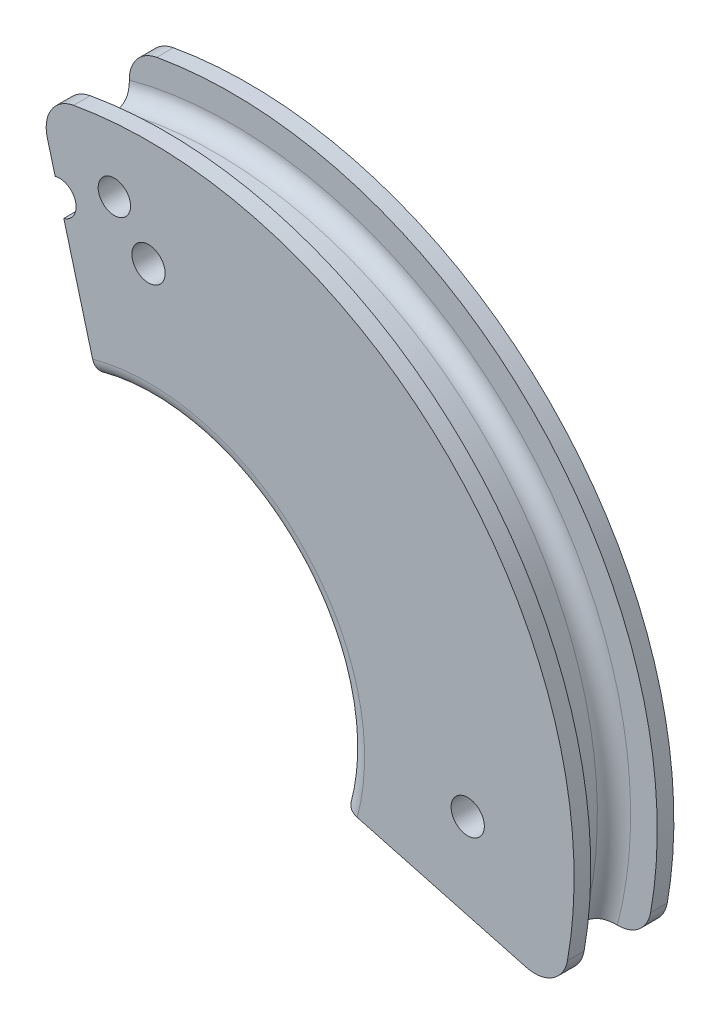
ISO-10303-21;
HEADER;
FILE_DESCRIPTION(('STEP AP214'),'2;1');
FILE_NAME('part.step','',(''),(''),'','','');
FILE_SCHEMA(('AUTOMOTIVE_DESIGN { 1 0 10303 214 1 1 1 1 }'));
ENDSEC;
DATA;
#1=APPLICATION_CONTEXT('core data for automotive mechanical design processes');
#2=APPLICATION_PROTOCOL_DEFINITION('international standard','automotive_design',2000,#1);
#3=PRODUCT_CONTEXT('',#1,'mechanical');
#4=PRODUCT('Part','Part','',(#3));
#5=PRODUCT_RELATED_PRODUCT_CATEGORY('part','',(#4));
#6=PRODUCT_DEFINITION_FORMATION('','',#4);
#7=PRODUCT_DEFINITION_CONTEXT('part definition',#1,'design');
#8=PRODUCT_DEFINITION('design','',#6,#7);
#9=PRODUCT_DEFINITION_SHAPE('','',#8);
#10=(LENGTH_UNIT() NAMED_UNIT(*) SI_UNIT(.MILLI.,.METRE.));
#11=(NAMED_UNIT(*) PLANE_ANGLE_UNIT() SI_UNIT($,.RADIAN.));
#12=(NAMED_UNIT(*) SI_UNIT($,.STERADIAN.) SOLID_ANGLE_UNIT());
#13=UNCERTAINTY_MEASURE_WITH_UNIT(LENGTH_MEASURE(1.E-05),#10,'distance_accuracy_value','');
#14=(GEOMETRIC_REPRESENTATION_CONTEXT(3) GLOBAL_UNCERTAINTY_ASSIGNED_CONTEXT((#13)) GLOBAL_UNIT_ASSIGNED_CONTEXT((#10,
#11,#12)) REPRESENTATION_CONTEXT('',''));
#15=CARTESIAN_POINT('',(0.,0.,0.));
#16=DIRECTION('',(0.,0.,1.));
#17=DIRECTION('',(1.,0.,0.));
#18=AXIS2_PLACEMENT_3D('',#15,#16,#17);
#19=CARTESIAN_POINT('',(-3.74363575167314,13.9714388302752,-1.5));
#20=DIRECTION('',(0.965925826289067,0.258819045102525,0.));
#21=DIRECTION('',(-0.258819045102525,0.965925826289067,0.));
#22=AXIS2_PLACEMENT_3D('',#19,#20,#21);
#23=PLANE('',#22);
#24=CARTESIAN_POINT('',(-3.1058285412303,11.5911099154688,-0.499999999999998));
#25=DIRECTION('',(0.965925826289067,0.258819045102525,0.));
#26=DIRECTION('',(-0.258819045102525,0.965925826289067,0.));
#27=AXIS2_PLACEMENT_3D('',#24,#25,#26);
#28=CIRCLE('',#27,0.500000000000002);
#29=CARTESIAN_POINT('',(-2.97641901867904,11.1081470023243,-0.499999999999998));
#30=VERTEX_POINT('',#29);
#31=CARTESIAN_POINT('',(-3.04307806183475,11.3569219381653,-0.937285225707565));
#32=VERTEX_POINT('',#31);
#33=EDGE_CURVE('E197',#30,#32,#28,.T.);
#34=ORIENTED_EDGE('',*,*,#33,.T.);
#35=DIRECTION('',(0.,0.,-1.));
#36=VECTOR('',#35,1.);
#37=CARTESIAN_POINT('',(-3.04307806183475,11.3569219381653,-1.5));
#38=LINE('',#37,#36);
#39=CARTESIAN_POINT('',(-3.04307806183475,11.3569219381653,-1.5));
#40=VERTEX_POINT('',#39);
#41=EDGE_CURVE('E11',#32,#40,#38,.T.);
#42=ORIENTED_EDGE('',*,*,#41,.T.);
#43=DIRECTION('',(-0.258819045102525,0.965925826289067,0.));
#44=VECTOR('',#43,1.);
#45=CARTESIAN_POINT('',(-3.74363575167314,13.9714388302752,-1.5));
#46=LINE('',#45,#44);
#47=CARTESIAN_POINT('',(-2.80628126212076,10.473184250563,-1.5));
#48=VERTEX_POINT('',#47);
#49=EDGE_CURVE('E179',#48,#40,#46,.T.);
#50=ORIENTED_EDGE('',*,*,#49,.F.);
#51=DIRECTION('',(0.,0.,1.));
#52=VECTOR('',#51,1.);
#53=CARTESIAN_POINT('',(-2.80628126212076,10.473184250563,-1.5));
#54=LINE('',#53,#52);
#55=CARTESIAN_POINT('',(-2.80628126212076,10.473184250563,1.5));
#56=VERTEX_POINT('',#55);
#57=EDGE_CURVE('E159',#48,#56,#54,.T.);
#58=ORIENTED_EDGE('',*,*,#57,.T.);
#59=DIRECTION('',(-0.258819045102525,0.965925826289067,0.));
#60=VECTOR('',#59,1.);
#61=CARTESIAN_POINT('',(-3.74363575167314,13.9714388302752,1.5));
#62=LINE('',#61,#60);
#63=CARTESIAN_POINT('',(-3.04307806183475,11.3569219381653,1.5));
#64=VERTEX_POINT('',#63);
#65=EDGE_CURVE('E370',#56,#64,#62,.T.);
#66=ORIENTED_EDGE('',*,*,#65,.T.);
#67=DIRECTION('',(0.,0.,-1.));
#68=VECTOR('',#67,1.);
#69=CARTESIAN_POINT('',(-3.04307806183475,11.3569219381653,1.));
#70=LINE('',#69,#68);
#71=CARTESIAN_POINT('',(-3.04307806183475,11.3569219381653,0.937285225707565));
#72=VERTEX_POINT('',#71);
#73=EDGE_CURVE('E41',#64,#72,#70,.T.);
#74=ORIENTED_EDGE('',*,*,#73,.T.);
#75=CARTESIAN_POINT('',(-3.1058285412303,11.5911099154688,0.499999999999998));
#76=DIRECTION('',(0.965925826289067,0.258819045102525,0.));
#77=DIRECTION('',(-0.258819045102525,0.965925826289067,0.));
#78=AXIS2_PLACEMENT_3D('',#75,#76,#77);
#79=CIRCLE('',#78,0.500000000000002);
#80=CARTESIAN_POINT('',(-2.97641901867904,11.1081470023243,0.499999999999998));
#81=VERTEX_POINT('',#80);
#82=EDGE_CURVE('E189',#72,#81,#79,.T.);
#83=ORIENTED_EDGE('',*,*,#82,.T.);
#84=DIRECTION('',(0.,0.,1.));
#85=VECTOR('',#84,1.);
#86=CARTESIAN_POINT('',(-2.97641901867904,11.1081470023243,0.));
#87=LINE('',#86,#85);
#88=EDGE_CURVE('E195',#81,#30,#87,.F.);
#89=ORIENTED_EDGE('',*,*,#88,.T.);
#90=EDGE_LOOP('',(#34,#42,#50,#58,#66,#74,#83,#89));
#91=FACE_BOUND('',#90,.T.);
#92=ADVANCED_FACE('F32',(#91),#23,.F.);
#93=CARTESIAN_POINT('',(0.,0.,1.5));
#94=DIRECTION('',(0.,0.,1.));
#95=DIRECTION('',(1.,0.,0.));
#96=AXIS2_PLACEMENT_3D('',#93,#94,#95);
#97=PLANE('',#96);
#98=DIRECTION('',(-0.965925826289068,0.258819045102521,0.));
#99=VECTOR('',#98,1.);
#100=CARTESIAN_POINT('',(14.9002332262777,-3.9925054600165,1.5));
#101=LINE('',#100,#99);
#102=CARTESIAN_POINT('',(11.3569219381653,-3.0430780618347,1.5));
#103=VERTEX_POINT('',#102);
#104=CARTESIAN_POINT('',(6.27851787087894,-1.68232379316639,1.5));
#105=VERTEX_POINT('',#104);
#106=EDGE_CURVE('E369',#103,#105,#101,.T.);
#107=ORIENTED_EDGE('',*,*,#106,.F.);
#108=CARTESIAN_POINT('',(11.6157409832678,-2.07715223554563,1.5));
#109=DIRECTION('',(0.,0.,1.));
#110=DIRECTION('',(1.,0.,0.));
#111=AXIS2_PLACEMENT_3D('',#108,#109,#110);
#112=CIRCLE('',#111,1.);
#113=CARTESIAN_POINT('',(12.6001258123583,-2.2531820860156,1.5));
#114=VERTEX_POINT('',#113);
#115=EDGE_CURVE('E422',#103,#114,#112,.T.);
#116=ORIENTED_EDGE('',*,*,#115,.T.);
#117=CARTESIAN_POINT('',(0.,0.,1.5));
#118=DIRECTION('',(0.,0.,1.));
#119=DIRECTION('',(1.,0.,0.));
#120=AXIS2_PLACEMENT_3D('',#117,#118,#119);
#121=CIRCLE('',#120,12.8);
#122=CARTESIAN_POINT('',(-2.25318208601565,12.6001258123583,1.5));
#123=VERTEX_POINT('',#122);
#124=EDGE_CURVE('E215',#114,#123,#121,.T.);
#125=ORIENTED_EDGE('',*,*,#124,.T.);
#126=CARTESIAN_POINT('',(-2.07715223554568,11.6157409832678,1.5));
#127=DIRECTION('',(0.,0.,1.));
#128=DIRECTION('',(1.,0.,0.));
#129=AXIS2_PLACEMENT_3D('',#126,#127,#128);
#130=CIRCLE('',#129,1.);
#131=EDGE_CURVE('E419',#123,#64,#130,.T.);
#132=ORIENTED_EDGE('',*,*,#131,.T.);
#133=ORIENTED_EDGE('',*,*,#65,.F.);
#134=CARTESIAN_POINT('',(-2.67687173956942,9.99022133741847,1.5));
#135=DIRECTION('',(0.,0.,1.));
#136=DIRECTION('',(1.,0.,0.));
#137=AXIS2_PLACEMENT_3D('',#134,#135,#136);
#138=CIRCLE('',#137,0.500000000000001);
#139=CARTESIAN_POINT('',(-2.54746221701823,9.50725842427392,1.5));
#140=VERTEX_POINT('',#139);
#141=EDGE_CURVE('E166',#140,#56,#138,.T.);
#142=ORIENTED_EDGE('',*,*,#141,.F.);
#143=CARTESIAN_POINT('',(-1.68232379316641,6.27851787087894,1.5));
#144=VERTEX_POINT('',#143);
#145=EDGE_CURVE('E190',#144,#140,#62,.T.);
#146=ORIENTED_EDGE('',*,*,#145,.F.);
#147=CARTESIAN_POINT('',(0.,0.,1.5));
#148=DIRECTION('',(0.,0.,1.));
#149=DIRECTION('',(1.,0.,0.));
#150=AXIS2_PLACEMENT_3D('',#147,#148,#149);
#151=CIRCLE('',#150,6.5);
#152=EDGE_CURVE('E256',#144,#105,#151,.F.);
#153=ORIENTED_EDGE('',*,*,#152,.T.);
#154=EDGE_LOOP('',(#107,#116,#125,#132,#133,#142,#146,#153));
#155=FACE_BOUND('',#154,.T.);
#156=CARTESIAN_POINT('',(-1.02683456633448,10.8290574039485,1.5));
#157=DIRECTION('',(0.,0.,1.));
#158=DIRECTION('',(1.,0.,0.));
#159=AXIS2_PLACEMENT_3D('',#156,#157,#158);
#160=CIRCLE('',#159,0.487297939704498);
#161=CARTESIAN_POINT('',(-0.539536626629982,10.8290574039485,1.5));
#162=VERTEX_POINT('',#161);
#163=EDGE_CURVE('E373',#162,#162,#160,.T.);
#164=ORIENTED_EDGE('',*,*,#163,.F.);
#165=EDGE_LOOP('',(#164));
#166=FACE_BOUND('',#165,.T.);
#167=CARTESIAN_POINT('',(9.6,0.,1.5));
#168=DIRECTION('',(0.,0.,1.));
#169=DIRECTION('',(1.,0.,0.));
#170=AXIS2_PLACEMENT_3D('',#167,#168,#169);
#171=CIRCLE('',#170,0.499999999999999);
#172=CARTESIAN_POINT('',(10.1,0.,1.5));
#173=VERTEX_POINT('',#172);
#174=EDGE_CURVE('E242',#173,#173,#171,.T.);
#175=ORIENTED_EDGE('',*,*,#174,.F.);
#176=EDGE_LOOP('',(#175));
#177=FACE_BOUND('',#176,.T.);
#178=CARTESIAN_POINT('',(1.00554662558682E-13,9.6,1.5));
#179=DIRECTION('',(0.,0.,1.));
#180=DIRECTION('',(1.,0.,0.));
#181=AXIS2_PLACEMENT_3D('',#178,#179,#180);
#182=CIRCLE('',#181,0.500000000000001);
#183=CARTESIAN_POINT('',(0.500000000000101,9.6,1.5));
#184=VERTEX_POINT('',#183);
#185=EDGE_CURVE('E236',#184,#184,#182,.T.);
#186=ORIENTED_EDGE('',*,*,#185,.F.);
#187=EDGE_LOOP('',(#186));
#188=FACE_BOUND('',#187,.T.);
#189=ADVANCED_FACE('F328',(#155,#166,#177,#188),#97,.T.);
#190=CARTESIAN_POINT('',(0.,0.,-1.5));
#191=DIRECTION('',(0.,0.,1.));
#192=DIRECTION('',(1.,0.,0.));
#193=AXIS2_PLACEMENT_3D('',#190,#191,#192);
#194=PLANE('',#193);
#195=CARTESIAN_POINT('',(-1.02683456633448,10.8290574039485,-1.5));
#196=DIRECTION('',(0.,0.,1.));
#197=DIRECTION('',(1.,0.,0.));
#198=AXIS2_PLACEMENT_3D('',#195,#196,#197);
#199=CIRCLE('',#198,0.487297939704498);
#200=CARTESIAN_POINT('',(-0.539536626629982,10.8290574039485,-1.5));
#201=VERTEX_POINT('',#200);
#202=EDGE_CURVE('E183',#201,#201,#199,.T.);
#203=ORIENTED_EDGE('',*,*,#202,.T.);
#204=EDGE_LOOP('',(#203));
#205=FACE_BOUND('',#204,.T.);
#206=CARTESIAN_POINT('',(0.,0.,-1.5));
#207=DIRECTION('',(0.,0.,1.));
#208=DIRECTION('',(1.,0.,0.));
#209=AXIS2_PLACEMENT_3D('',#206,#207,#208);
#210=CIRCLE('',#209,12.8);
#211=CARTESIAN_POINT('',(12.6001258123583,-2.2531820860156,-1.5));
#212=VERTEX_POINT('',#211);
#213=CARTESIAN_POINT('',(-2.25318208601565,12.6001258123583,-1.5));
#214=VERTEX_POINT('',#213);
#215=EDGE_CURVE('E218',#212,#214,#210,.T.);
#216=ORIENTED_EDGE('',*,*,#215,.F.);
#217=CARTESIAN_POINT('',(11.6157409832678,-2.07715223554563,-1.5));
#218=DIRECTION('',(0.,0.,1.));
#219=DIRECTION('',(1.,0.,0.));
#220=AXIS2_PLACEMENT_3D('',#217,#218,#219);
#221=CIRCLE('',#220,1.);
#222=CARTESIAN_POINT('',(11.3569219381653,-3.0430780618347,-1.5));
#223=VERTEX_POINT('',#222);
#224=EDGE_CURVE('E416',#212,#223,#221,.F.);
#225=ORIENTED_EDGE('',*,*,#224,.T.);
#226=DIRECTION('',(-0.965925826289068,0.258819045102521,0.));
#227=VECTOR('',#226,1.);
#228=CARTESIAN_POINT('',(14.9002332262777,-3.9925054600165,-1.5));
#229=LINE('',#228,#227);
#230=CARTESIAN_POINT('',(6.27851787087894,-1.68232379316639,-1.5));
#231=VERTEX_POINT('',#230);
#232=EDGE_CURVE('E187',#223,#231,#229,.T.);
#233=ORIENTED_EDGE('',*,*,#232,.T.);
#234=CARTESIAN_POINT('',(0.,0.,-1.5));
#235=DIRECTION('',(0.,0.,1.));
#236=DIRECTION('',(1.,0.,0.));
#237=AXIS2_PLACEMENT_3D('',#234,#235,#236);
#238=CIRCLE('',#237,6.5);
#239=CARTESIAN_POINT('',(-1.68232379316641,6.27851787087894,-1.5));
#240=VERTEX_POINT('',#239);
#241=EDGE_CURVE('E264',#231,#240,#238,.T.);
#242=ORIENTED_EDGE('',*,*,#241,.T.);
#243=CARTESIAN_POINT('',(-2.54746221701823,9.50725842427392,-1.5));
#244=VERTEX_POINT('',#243);
#245=EDGE_CURVE('E182',#240,#244,#46,.T.);
#246=ORIENTED_EDGE('',*,*,#245,.T.);
#247=CARTESIAN_POINT('',(-2.67687173956942,9.99022133741847,-1.5));
#248=DIRECTION('',(0.,0.,1.));
#249=DIRECTION('',(1.,0.,0.));
#250=AXIS2_PLACEMENT_3D('',#247,#248,#249);
#251=CIRCLE('',#250,0.500000000000001);
#252=EDGE_CURVE('E163',#244,#48,#251,.T.);
#253=ORIENTED_EDGE('',*,*,#252,.T.);
#254=ORIENTED_EDGE('',*,*,#49,.T.);
#255=CARTESIAN_POINT('',(-2.07715223554568,11.6157409832678,-1.5));
#256=DIRECTION('',(0.,0.,1.));
#257=DIRECTION('',(1.,0.,0.));
#258=AXIS2_PLACEMENT_3D('',#255,#256,#257);
#259=CIRCLE('',#258,1.);
#260=EDGE_CURVE('E420',#40,#214,#259,.F.);
#261=ORIENTED_EDGE('',*,*,#260,.T.);
#262=EDGE_LOOP('',(#216,#225,#233,#242,#246,#253,#254,#261));
#263=FACE_BOUND('',#262,.T.);
#264=CARTESIAN_POINT('',(9.6,0.,-1.5));
#265=DIRECTION('',(0.,0.,1.));
#266=DIRECTION('',(1.,0.,0.));
#267=AXIS2_PLACEMENT_3D('',#264,#265,#266);
#268=CIRCLE('',#267,0.499999999999999);
#269=CARTESIAN_POINT('',(10.1,0.,-1.5));
#270=VERTEX_POINT('',#269);
#271=EDGE_CURVE('E239',#270,#270,#268,.T.);
#272=ORIENTED_EDGE('',*,*,#271,.T.);
#273=EDGE_LOOP('',(#272));
#274=FACE_BOUND('',#273,.T.);
#275=CARTESIAN_POINT('',(1.00554662558682E-13,9.6,-1.5));
#276=DIRECTION('',(0.,0.,1.));
#277=DIRECTION('',(1.,0.,0.));
#278=AXIS2_PLACEMENT_3D('',#275,#276,#277);
#279=CIRCLE('',#278,0.500000000000001);
#280=CARTESIAN_POINT('',(0.500000000000101,9.6,-1.5));
#281=VERTEX_POINT('',#280);
#282=EDGE_CURVE('E235',#281,#281,#279,.T.);
#283=ORIENTED_EDGE('',*,*,#282,.T.);
#284=EDGE_LOOP('',(#283));
#285=FACE_BOUND('',#284,.T.);
#286=ADVANCED_FACE('F177',(#205,#263,#274,#285),#194,.F.);
#287=CARTESIAN_POINT('',(0.,0.,1.5));
#288=DIRECTION('',(0.,0.,-1.));
#289=DIRECTION('',(-1.,0.,0.));
#290=AXIS2_PLACEMENT_3D('',#287,#288,#289);
#291=CYLINDRICAL_SURFACE('',#290,6.);
#292=DIRECTION('',(0.,0.,-1.));
#293=VECTOR('',#292,1.);
#294=CARTESIAN_POINT('',(5.79555495773441,-1.55291427061513,1.5));
#295=LINE('',#294,#293);
#296=CARTESIAN_POINT('',(5.79555495773441,-1.55291427061513,1.));
#297=VERTEX_POINT('',#296);
#298=CARTESIAN_POINT('',(5.79555495773441,-1.55291427061513,-1.));
#299=VERTEX_POINT('',#298);
#300=EDGE_CURVE('E209',#297,#299,#295,.T.);
#301=ORIENTED_EDGE('',*,*,#300,.F.);
#302=CARTESIAN_POINT('',(0.,0.,1.));
#303=DIRECTION('',(0.,0.,1.));
#304=DIRECTION('',(1.,0.,0.));
#305=AXIS2_PLACEMENT_3D('',#302,#303,#304);
#306=CIRCLE('',#305,6.);
#307=CARTESIAN_POINT('',(-1.55291427061515,5.7955549577344,1.));
#308=VERTEX_POINT('',#307);
#309=EDGE_CURVE('E249',#297,#308,#306,.T.);
#310=ORIENTED_EDGE('',*,*,#309,.T.);
#311=DIRECTION('',(0.,0.,-1.));
#312=VECTOR('',#311,1.);
#313=CARTESIAN_POINT('',(-1.55291427061515,5.7955549577344,1.5));
#314=LINE('',#313,#312);
#315=CARTESIAN_POINT('',(-1.55291427061515,5.7955549577344,-1.));
#316=VERTEX_POINT('',#315);
#317=EDGE_CURVE('E199',#316,#308,#314,.F.);
#318=ORIENTED_EDGE('',*,*,#317,.F.);
#319=CARTESIAN_POINT('',(0.,0.,-1.));
#320=DIRECTION('',(0.,0.,1.));
#321=DIRECTION('',(1.,0.,0.));
#322=AXIS2_PLACEMENT_3D('',#319,#320,#321);
#323=CIRCLE('',#322,6.);
#324=EDGE_CURVE('E171',#316,#299,#323,.F.);
#325=ORIENTED_EDGE('',*,*,#324,.T.);
#326=EDGE_LOOP('',(#301,#310,#318,#325));
#327=FACE_BOUND('',#326,.T.);
#328=ADVANCED_FACE('F355',(#327),#291,.F.);
#329=CARTESIAN_POINT('',(9.6,0.,1.5));
#330=DIRECTION('',(0.,0.,-1.));
#331=DIRECTION('',(-1.,0.,0.));
#332=AXIS2_PLACEMENT_3D('',#329,#330,#331);
#333=CYLINDRICAL_SURFACE('',#332,0.499999999999999);
#334=ORIENTED_EDGE('',*,*,#174,.T.);
#335=EDGE_LOOP('',(#334));
#336=FACE_BOUND('',#335,.T.);
#337=ORIENTED_EDGE('',*,*,#271,.F.);
#338=EDGE_LOOP('',(#337));
#339=FACE_BOUND('',#338,.T.);
#340=ADVANCED_FACE('F398',(#336,#339),#333,.F.);
#341=CARTESIAN_POINT('',(1.00554662558682E-13,9.6,1.5));
#342=DIRECTION('',(0.,0.,-1.));
#343=DIRECTION('',(-1.,0.,0.));
#344=AXIS2_PLACEMENT_3D('',#341,#342,#343);
#345=CYLINDRICAL_SURFACE('',#344,0.500000000000001);
#346=ORIENTED_EDGE('',*,*,#185,.T.);
#347=EDGE_LOOP('',(#346));
#348=FACE_BOUND('',#347,.T.);
#349=ORIENTED_EDGE('',*,*,#282,.F.);
#350=EDGE_LOOP('',(#349));
#351=FACE_BOUND('',#350,.T.);
#352=ADVANCED_FACE('F324',(#348,#351),#345,.F.);
#353=CARTESIAN_POINT('',(0.,0.,-0.499999999999998));
#354=DIRECTION('',(0.,0.,1.));
#355=DIRECTION('',(1.,0.,0.));
#356=AXIS2_PLACEMENT_3D('',#353,#354,#355);
#357=TOROIDAL_SURFACE('',#356,12.,0.500000000000002);
#358=CARTESIAN_POINT('',(11.5911099154688,-3.10582854123025,-0.499999999999998));
#359=DIRECTION('',(0.258819045102521,0.965925826289068,0.));
#360=DIRECTION('',(-0.965925826289068,0.258819045102521,0.));
#361=AXIS2_PLACEMENT_3D('',#358,#359,#360);
#362=CIRCLE('',#361,0.500000000000002);
#363=CARTESIAN_POINT('',(11.3569219381653,-3.0430780618347,-0.937285225707565));
#364=VERTEX_POINT('',#363);
#365=CARTESIAN_POINT('',(11.1081470023243,-2.97641901867899,-0.499999999999998));
#366=VERTEX_POINT('',#365);
#367=EDGE_CURVE('E207',#364,#366,#362,.T.);
#368=ORIENTED_EDGE('',*,*,#367,.F.);
#369=CARTESIAN_POINT('',(11.3569219381653,-3.0430780618347,-0.937285225707565));
#370=CARTESIAN_POINT('',(11.3788907022271,-3.04899831611114,-0.949943539683777));
#371=CARTESIAN_POINT('',(11.4020780861868,-3.05437532809976,-0.960766771828405));
#372=CARTESIAN_POINT('',(11.4496007428172,-3.06353569894288,-0.978371417856458));
#373=CARTESIAN_POINT('',(11.4738969178736,-3.06735312809629,-0.985240754489292));
#374=CARTESIAN_POINT('',(11.5149442494263,-3.07219577508378,-0.993465018538642));
#375=CARTESIAN_POINT('',(11.531426924697,-3.07372956647898,-0.995903041619362));
#376=CARTESIAN_POINT('',(11.5648655383223,-3.07600064981872,-0.999184648848311));
#377=CARTESIAN_POINT('',(11.581824849703,-3.07672517119939,-1.00000282200904));
#378=CARTESIAN_POINT('',(11.59879381403,-3.07700862196078,-1.00000000000002));
#379=B_SPLINE_CURVE_WITH_KNOTS('',3,(#369,#370,#371,#372,#373,#374,#375,#376,#377,#378),
.UNSPECIFIED.,.F.,.F.,(4,2,2,2,4),(0.,0.0780439203151207,0.154277705368697,0.204380010066996,
0.25526224375088),.UNSPECIFIED.);
#380=CARTESIAN_POINT('',(11.59879381403,-3.0770086219606,-1.));
#381=VERTEX_POINT('',#380);
#382=EDGE_CURVE('E278',#364,#381,#379,.T.);
#383=ORIENTED_EDGE('',*,*,#382,.T.);
#384=CARTESIAN_POINT('',(0.,0.,-1.));
#385=DIRECTION('',(0.,0.,1.));
#386=DIRECTION('',(1.,0.,0.));
#387=AXIS2_PLACEMENT_3D('',#384,#385,#386);
#388=CIRCLE('',#387,12.);
#389=CARTESIAN_POINT('',(-3.07700862196066,11.59879381403,-1.));
#390=VERTEX_POINT('',#389);
#391=EDGE_CURVE('E224',#381,#390,#388,.T.);
#392=ORIENTED_EDGE('',*,*,#391,.T.);
#393=CARTESIAN_POINT('',(-3.07700862196066,11.59879381403,-1.));
#394=CARTESIAN_POINT('',(-3.07660458449419,11.5727601819554,-1.00003894836341));
#395=CARTESIAN_POINT('',(-3.07511026037198,11.5467286746794,-0.998086003587239));
#396=CARTESIAN_POINT('',(-3.07027226218953,11.4960485993055,-0.990321356288697));
#397=CARTESIAN_POINT('',(-3.06697226123266,11.4713819615224,-0.984600153749769));
#398=CARTESIAN_POINT('',(-3.06020836080265,11.4317329932909,-0.972022151730217));
#399=CARTESIAN_POINT('',(-3.05718836163848,11.4163292860042,-0.966226791143053));
#400=CARTESIAN_POINT('',(-3.05054927334866,11.386085156282,-0.952986500989708));
#401=CARTESIAN_POINT('',(-3.0469215908292,11.3712572336561,-0.945517299304913));
#402=CARTESIAN_POINT('',(-3.04307806183475,11.3569219381653,-0.937285225707566));
#403=B_SPLINE_CURVE_WITH_KNOTS('',3,(#393,#394,#395,#396,#397,#398,#399,#400,#401,#402),
.UNSPECIFIED.,.F.,.F.,(4,2,2,2,4),(0.,0.0780427071951764,0.154276292796439,0.204379307922696,
0.255262197451977),.UNSPECIFIED.);
#404=EDGE_CURVE('E272',#390,#32,#403,.T.);
#405=ORIENTED_EDGE('',*,*,#404,.T.);
#406=ORIENTED_EDGE('',*,*,#33,.F.);
#407=CARTESIAN_POINT('',(0.,0.,-0.499999999999998));
#408=DIRECTION('',(0.,0.,1.));
#409=DIRECTION('',(1.,0.,0.));
#410=AXIS2_PLACEMENT_3D('',#407,#408,#409);
#411=CIRCLE('',#410,11.5);
#412=EDGE_CURVE('E232',#366,#30,#411,.T.);
#413=ORIENTED_EDGE('',*,*,#412,.F.);
#414=EDGE_LOOP('',(#368,#383,#392,#405,#406,#413));
#415=FACE_BOUND('',#414,.T.);
#416=ADVANCED_FACE('F284',(#415),#357,.F.);
#417=CARTESIAN_POINT('',(0.,0.,0.));
#418=DIRECTION('',(0.,0.,1.));
#419=DIRECTION('',(1.,0.,0.));
#420=AXIS2_PLACEMENT_3D('',#417,#418,#419);
#421=CYLINDRICAL_SURFACE('',#420,11.5);
#422=DIRECTION('',(0.,0.,1.));
#423=VECTOR('',#422,1.);
#424=CARTESIAN_POINT('',(11.1081470023243,-2.97641901867899,0.));
#425=LINE('',#424,#423);
#426=CARTESIAN_POINT('',(11.1081470023243,-2.97641901867899,0.499999999999998));
#427=VERTEX_POINT('',#426);
#428=EDGE_CURVE('E205',#366,#427,#425,.T.);
#429=ORIENTED_EDGE('',*,*,#428,.F.);
#430=ORIENTED_EDGE('',*,*,#412,.T.);
#431=ORIENTED_EDGE('',*,*,#88,.F.);
#432=CARTESIAN_POINT('',(0.,0.,0.499999999999998));
#433=DIRECTION('',(0.,0.,1.));
#434=DIRECTION('',(1.,0.,0.));
#435=AXIS2_PLACEMENT_3D('',#432,#433,#434);
#436=CIRCLE('',#435,11.5);
#437=EDGE_CURVE('E229',#427,#81,#436,.T.);
#438=ORIENTED_EDGE('',*,*,#437,.F.);
#439=EDGE_LOOP('',(#429,#430,#431,#438));
#440=FACE_BOUND('',#439,.T.);
#441=ADVANCED_FACE('F316',(#440),#421,.T.);
#442=CARTESIAN_POINT('',(0.,0.,0.499999999999998));
#443=DIRECTION('',(0.,0.,1.));
#444=DIRECTION('',(1.,0.,0.));
#445=AXIS2_PLACEMENT_3D('',#442,#443,#444);
#446=TOROIDAL_SURFACE('',#445,12.,0.500000000000002);
#447=CARTESIAN_POINT('',(0.,0.,1.));
#448=DIRECTION('',(0.,0.,1.));
#449=DIRECTION('',(1.,0.,0.));
#450=AXIS2_PLACEMENT_3D('',#447,#448,#449);
#451=CIRCLE('',#450,12.);
#452=CARTESIAN_POINT('',(11.59879381403,-3.07700862196061,1.));
#453=VERTEX_POINT('',#452);
#454=CARTESIAN_POINT('',(-3.07700862196067,11.59879381403,1.));
#455=VERTEX_POINT('',#454);
#456=EDGE_CURVE('E227',#453,#455,#451,.T.);
#457=ORIENTED_EDGE('',*,*,#456,.F.);
#458=CARTESIAN_POINT('',(11.59879381403,-3.07700862196061,1.));
#459=CARTESIAN_POINT('',(11.5727601819554,-3.07660458449414,1.00003894836341));
#460=CARTESIAN_POINT('',(11.5467286746794,-3.07511026037193,0.998086003587239));
#461=CARTESIAN_POINT('',(11.4960485993056,-3.07027226218948,0.990321356288697));
#462=CARTESIAN_POINT('',(11.4713819615224,-3.06697226123261,0.984600153749768));
#463=CARTESIAN_POINT('',(11.4317329932909,-3.0602083608026,0.972022151730217));
#464=CARTESIAN_POINT('',(11.4163292860042,-3.05718836163843,0.966226791143054));
#465=CARTESIAN_POINT('',(11.386085156282,-3.05054927334861,0.952986500989709));
#466=CARTESIAN_POINT('',(11.3712572336561,-3.04692159082915,0.945517299304914));
#467=CARTESIAN_POINT('',(11.3569219381653,-3.0430780618347,0.937285225707565));
#468=B_SPLINE_CURVE_WITH_KNOTS('',3,(#458,#459,#460,#461,#462,#463,#464,#465,#466,#467),
.UNSPECIFIED.,.F.,.F.,(4,2,2,2,4),(0.,0.0780427071951764,0.154276292796439,0.204379307922698,
0.255262197451979),.UNSPECIFIED.);
#469=CARTESIAN_POINT('',(11.3569219381653,-3.0430780618347,0.937285225707565));
#470=VERTEX_POINT('',#469);
#471=EDGE_CURVE('E301',#453,#470,#468,.T.);
#472=ORIENTED_EDGE('',*,*,#471,.T.);
#473=CARTESIAN_POINT('',(11.5911099154688,-3.10582854123025,0.499999999999998));
#474=DIRECTION('',(0.258819045102521,0.965925826289068,0.));
#475=DIRECTION('',(-0.965925826289068,0.258819045102521,0.));
#476=AXIS2_PLACEMENT_3D('',#473,#474,#475);
#477=CIRCLE('',#476,0.500000000000002);
#478=EDGE_CURVE('E202',#427,#470,#477,.T.);
#479=ORIENTED_EDGE('',*,*,#478,.F.);
#480=ORIENTED_EDGE('',*,*,#437,.T.);
#481=ORIENTED_EDGE('',*,*,#82,.F.);
#482=CARTESIAN_POINT('',(-3.04307806183475,11.3569219381653,0.937285225707565));
#483=CARTESIAN_POINT('',(-3.04899831611119,11.3788907022271,0.949943539683777));
#484=CARTESIAN_POINT('',(-3.05437532809981,11.4020780861868,0.960766771828404));
#485=CARTESIAN_POINT('',(-3.06353569894293,11.4496007428172,0.978371417856458));
#486=CARTESIAN_POINT('',(-3.06735312809634,11.4738969178736,0.985240754489291));
#487=CARTESIAN_POINT('',(-3.07219577508383,11.5149442494263,0.993465018538642));
#488=CARTESIAN_POINT('',(-3.07372956647903,11.5314269246969,0.995903041619362));
#489=CARTESIAN_POINT('',(-3.07600064981877,11.5648655383223,0.999184648848312));
#490=CARTESIAN_POINT('',(-3.07672517119944,11.5818248497029,1.00000282200904));
#491=CARTESIAN_POINT('',(-3.07700862196083,11.5987938140299,1.00000000000002));
#492=B_SPLINE_CURVE_WITH_KNOTS('',3,(#482,#483,#484,#485,#486,#487,#488,#489,#490,#491),
.UNSPECIFIED.,.F.,.F.,(4,2,2,2,4),(0.,0.0780439203151175,0.154277705368694,0.204380010066994,
0.255262243750883),.UNSPECIFIED.);
#493=EDGE_CURVE('E48',#72,#455,#492,.T.);
#494=ORIENTED_EDGE('',*,*,#493,.T.);
#495=EDGE_LOOP('',(#457,#472,#479,#480,#481,#494));
#496=FACE_BOUND('',#495,.T.);
#497=ADVANCED_FACE('F311',(#496),#446,.F.);
#498=CARTESIAN_POINT('',(12.,0.,-1.));
#499=DIRECTION('',(0.,0.,1.));
#500=DIRECTION('',(1.,0.,0.));
#501=AXIS2_PLACEMENT_3D('',#498,#499,#500);
#502=PLANE('',#501);
#503=ORIENTED_EDGE('',*,*,#391,.F.);
#504=CARTESIAN_POINT('',(11.6157409832678,-2.07715223554563,-1.));
#505=DIRECTION('',(0.,0.,1.));
#506=DIRECTION('',(1.,0.,0.));
#507=AXIS2_PLACEMENT_3D('',#504,#505,#506);
#508=CIRCLE('',#507,1.);
#509=CARTESIAN_POINT('',(12.6001258123583,-2.2531820860156,-1.));
#510=VERTEX_POINT('',#509);
#511=EDGE_CURVE('E454',#381,#510,#508,.T.);
#512=ORIENTED_EDGE('',*,*,#511,.T.);
#513=CARTESIAN_POINT('',(0.,0.,-1.));
#514=DIRECTION('',(0.,0.,1.));
#515=DIRECTION('',(1.,0.,0.));
#516=AXIS2_PLACEMENT_3D('',#513,#514,#515);
#517=CIRCLE('',#516,12.8);
#518=CARTESIAN_POINT('',(-2.25318208601565,12.6001258123583,-1.));
#519=VERTEX_POINT('',#518);
#520=EDGE_CURVE('E221',#510,#519,#517,.T.);
#521=ORIENTED_EDGE('',*,*,#520,.T.);
#522=CARTESIAN_POINT('',(-2.07715223554568,11.6157409832678,-1.));
#523=DIRECTION('',(0.,0.,1.));
#524=DIRECTION('',(1.,0.,0.));
#525=AXIS2_PLACEMENT_3D('',#522,#523,#524);
#526=CIRCLE('',#525,1.);
#527=EDGE_CURVE('E449',#519,#390,#526,.T.);
#528=ORIENTED_EDGE('',*,*,#527,.T.);
#529=EDGE_LOOP('',(#503,#512,#521,#528));
#530=FACE_BOUND('',#529,.T.);
#531=ADVANCED_FACE('F315',(#530),#502,.T.);
#532=CARTESIAN_POINT('',(0.,0.,0.));
#533=DIRECTION('',(0.,0.,1.));
#534=DIRECTION('',(1.,0.,0.));
#535=AXIS2_PLACEMENT_3D('',#532,#533,#534);
#536=CYLINDRICAL_SURFACE('',#535,12.8);
#537=ORIENTED_EDGE('',*,*,#520,.F.);
#538=DIRECTION('',(0.,0.,1.));
#539=VECTOR('',#538,1.);
#540=CARTESIAN_POINT('',(12.6001258123583,-2.2531820860156,0.));
#541=LINE('',#540,#539);
#542=EDGE_CURVE('E418',#510,#212,#541,.F.);
#543=ORIENTED_EDGE('',*,*,#542,.T.);
#544=ORIENTED_EDGE('',*,*,#215,.T.);
#545=DIRECTION('',(0.,0.,1.));
#546=VECTOR('',#545,1.);
#547=CARTESIAN_POINT('',(-2.25318208601565,12.6001258123583,0.));
#548=LINE('',#547,#546);
#549=EDGE_CURVE('E450',#214,#519,#548,.T.);
#550=ORIENTED_EDGE('',*,*,#549,.T.);
#551=EDGE_LOOP('',(#537,#543,#544,#550));
#552=FACE_BOUND('',#551,.T.);
#553=ADVANCED_FACE('F453',(#552),#536,.T.);
#554=CARTESIAN_POINT('',(0.,0.,0.));
#555=DIRECTION('',(0.,0.,1.));
#556=DIRECTION('',(1.,0.,0.));
#557=AXIS2_PLACEMENT_3D('',#554,#555,#556);
#558=CYLINDRICAL_SURFACE('',#557,12.8);
#559=ORIENTED_EDGE('',*,*,#124,.F.);
#560=DIRECTION('',(0.,0.,1.));
#561=VECTOR('',#560,1.);
#562=CARTESIAN_POINT('',(12.6001258123583,-2.2531820860156,0.));
#563=LINE('',#562,#561);
#564=CARTESIAN_POINT('',(12.6001258123583,-2.2531820860156,1.));
#565=VERTEX_POINT('',#564);
#566=EDGE_CURVE('E430',#114,#565,#563,.F.);
#567=ORIENTED_EDGE('',*,*,#566,.T.);
#568=CARTESIAN_POINT('',(0.,0.,1.));
#569=DIRECTION('',(0.,0.,1.));
#570=DIRECTION('',(1.,0.,0.));
#571=AXIS2_PLACEMENT_3D('',#568,#569,#570);
#572=CIRCLE('',#571,12.8);
#573=CARTESIAN_POINT('',(-2.25318208601565,12.6001258123583,1.));
#574=VERTEX_POINT('',#573);
#575=EDGE_CURVE('E212',#565,#574,#572,.T.);
#576=ORIENTED_EDGE('',*,*,#575,.T.);
#577=DIRECTION('',(0.,0.,1.));
#578=VECTOR('',#577,1.);
#579=CARTESIAN_POINT('',(-2.25318208601565,12.6001258123583,0.));
#580=LINE('',#579,#578);
#581=EDGE_CURVE('E428',#574,#123,#580,.T.);
#582=ORIENTED_EDGE('',*,*,#581,.T.);
#583=EDGE_LOOP('',(#559,#567,#576,#582));
#584=FACE_BOUND('',#583,.T.);
#585=ADVANCED_FACE('F347',(#584),#558,.T.);
#586=CARTESIAN_POINT('',(12.,0.,1.));
#587=DIRECTION('',(0.,0.,-1.));
#588=DIRECTION('',(-1.,0.,0.));
#589=AXIS2_PLACEMENT_3D('',#586,#587,#588);
#590=PLANE('',#589);
#591=ORIENTED_EDGE('',*,*,#575,.F.);
#592=CARTESIAN_POINT('',(11.6157409832678,-2.07715223554563,1.));
#593=DIRECTION('',(0.,0.,-1.));
#594=DIRECTION('',(-1.,0.,0.));
#595=AXIS2_PLACEMENT_3D('',#592,#593,#594);
#596=CIRCLE('',#595,1.);
#597=EDGE_CURVE('E433',#565,#453,#596,.T.);
#598=ORIENTED_EDGE('',*,*,#597,.T.);
#599=ORIENTED_EDGE('',*,*,#456,.T.);
#600=CARTESIAN_POINT('',(-2.07715223554568,11.6157409832678,1.));
#601=DIRECTION('',(0.,0.,-1.));
#602=DIRECTION('',(-1.,0.,0.));
#603=AXIS2_PLACEMENT_3D('',#600,#601,#602);
#604=CIRCLE('',#603,1.);
#605=EDGE_CURVE('E432',#455,#574,#604,.T.);
#606=ORIENTED_EDGE('',*,*,#605,.T.);
#607=EDGE_LOOP('',(#591,#598,#599,#606));
#608=FACE_BOUND('',#607,.T.);
#609=ADVANCED_FACE('F340',(#608),#590,.T.);
#610=ORIENTED_EDGE('',*,*,#317,.T.);
#611=CARTESIAN_POINT('',(-1.68232379316641,6.27851787087894,1.));
#612=DIRECTION('',(0.965925826289067,0.258819045102525,0.));
#613=DIRECTION('',(-0.258819045102525,0.965925826289067,0.));
#614=AXIS2_PLACEMENT_3D('',#611,#612,#613);
#615=CIRCLE('',#614,0.5);
#616=EDGE_CURVE('E254',#308,#144,#615,.F.);
#617=ORIENTED_EDGE('',*,*,#616,.T.);
#618=ORIENTED_EDGE('',*,*,#145,.T.);
#619=DIRECTION('',(0.,0.,1.));
#620=VECTOR('',#619,1.);
#621=CARTESIAN_POINT('',(-2.54746221701823,9.50725842427392,-1.5));
#622=LINE('',#621,#620);
#623=EDGE_CURVE('E172',#140,#244,#622,.F.);
#624=ORIENTED_EDGE('',*,*,#623,.T.);
#625=ORIENTED_EDGE('',*,*,#245,.F.);
#626=CARTESIAN_POINT('',(-1.68232379316641,6.27851787087894,-1.));
#627=DIRECTION('',(0.965925826289067,0.258819045102525,0.));
#628=DIRECTION('',(-0.258819045102525,0.965925826289067,0.));
#629=AXIS2_PLACEMENT_3D('',#626,#627,#628);
#630=CIRCLE('',#629,0.5);
#631=EDGE_CURVE('E252',#240,#316,#630,.F.);
#632=ORIENTED_EDGE('',*,*,#631,.T.);
#633=EDGE_LOOP('',(#610,#617,#618,#624,#625,#632));
#634=FACE_BOUND('',#633,.T.);
#635=ADVANCED_FACE('F330',(#634),#23,.F.);
#636=CARTESIAN_POINT('',(14.9002332262777,-3.9925054600165,-1.5));
#637=DIRECTION('',(0.258819045102521,0.965925826289068,0.));
#638=DIRECTION('',(-0.965925826289068,0.258819045102521,0.));
#639=AXIS2_PLACEMENT_3D('',#636,#637,#638);
#640=PLANE('',#639);
#641=ORIENTED_EDGE('',*,*,#232,.F.);
#642=DIRECTION('',(0.,0.,-1.));
#643=VECTOR('',#642,1.);
#644=CARTESIAN_POINT('',(11.3569219381653,-3.0430780618347,-1.));
#645=LINE('',#644,#643);
#646=EDGE_CURVE('E269',#223,#364,#645,.F.);
#647=ORIENTED_EDGE('',*,*,#646,.T.);
#648=ORIENTED_EDGE('',*,*,#367,.T.);
#649=ORIENTED_EDGE('',*,*,#428,.T.);
#650=ORIENTED_EDGE('',*,*,#478,.T.);
#651=DIRECTION('',(0.,0.,-1.));
#652=VECTOR('',#651,1.);
#653=CARTESIAN_POINT('',(11.3569219381653,-3.0430780618347,1.5));
#654=LINE('',#653,#652);
#655=EDGE_CURVE('E266',#470,#103,#654,.F.);
#656=ORIENTED_EDGE('',*,*,#655,.T.);
#657=ORIENTED_EDGE('',*,*,#106,.T.);
#658=CARTESIAN_POINT('',(6.27851787087894,-1.68232379316639,1.));
#659=DIRECTION('',(0.258819045102521,0.965925826289068,0.));
#660=DIRECTION('',(-0.965925826289068,0.258819045102521,0.));
#661=AXIS2_PLACEMENT_3D('',#658,#659,#660);
#662=CIRCLE('',#661,0.5);
#663=EDGE_CURVE('E262',#105,#297,#662,.F.);
#664=ORIENTED_EDGE('',*,*,#663,.T.);
#665=ORIENTED_EDGE('',*,*,#300,.T.);
#666=CARTESIAN_POINT('',(6.27851787087894,-1.68232379316639,-1.));
#667=DIRECTION('',(0.258819045102521,0.965925826289068,0.));
#668=DIRECTION('',(-0.965925826289068,0.258819045102521,0.));
#669=AXIS2_PLACEMENT_3D('',#666,#667,#668);
#670=CIRCLE('',#669,0.5);
#671=EDGE_CURVE('E259',#299,#231,#670,.F.);
#672=ORIENTED_EDGE('',*,*,#671,.T.);
#673=EDGE_LOOP('',(#641,#647,#648,#649,#650,#656,#657,#664,#665,#672));
#674=FACE_BOUND('',#673,.T.);
#675=ADVANCED_FACE('F339',(#674),#640,.F.);
#676=CARTESIAN_POINT('',(-2.67687173956942,9.99022133741847,-1.5));
#677=DIRECTION('',(0.,0.,1.));
#678=DIRECTION('',(1.,0.,0.));
#679=AXIS2_PLACEMENT_3D('',#676,#677,#678);
#680=CYLINDRICAL_SURFACE('',#679,0.500000000000001);
#681=ORIENTED_EDGE('',*,*,#252,.F.);
#682=ORIENTED_EDGE('',*,*,#623,.F.);
#683=ORIENTED_EDGE('',*,*,#141,.T.);
#684=ORIENTED_EDGE('',*,*,#57,.F.);
#685=EDGE_LOOP('',(#681,#682,#683,#684));
#686=FACE_BOUND('',#685,.T.);
#687=ADVANCED_FACE('F161',(#686),#680,.F.);
#688=CARTESIAN_POINT('',(-1.02683456633448,10.8290574039485,-1.5));
#689=DIRECTION('',(0.,0.,1.));
#690=DIRECTION('',(1.,0.,0.));
#691=AXIS2_PLACEMENT_3D('',#688,#689,#690);
#692=CYLINDRICAL_SURFACE('',#691,0.487297939704498);
#693=ORIENTED_EDGE('',*,*,#163,.T.);
#694=EDGE_LOOP('',(#693));
#695=FACE_BOUND('',#694,.T.);
#696=ORIENTED_EDGE('',*,*,#202,.F.);
#697=EDGE_LOOP('',(#696));
#698=FACE_BOUND('',#697,.T.);
#699=ADVANCED_FACE('F381',(#695,#698),#692,.F.);
#700=CARTESIAN_POINT('',(0.,0.,1.));
#701=DIRECTION('',(0.,0.,1.));
#702=DIRECTION('',(1.,0.,0.));
#703=AXIS2_PLACEMENT_3D('',#700,#701,#702);
#704=TOROIDAL_SURFACE('',#703,6.5,0.5);
#705=ORIENTED_EDGE('',*,*,#663,.F.);
#706=ORIENTED_EDGE('',*,*,#152,.F.);
#707=ORIENTED_EDGE('',*,*,#616,.F.);
#708=ORIENTED_EDGE('',*,*,#309,.F.);
#709=EDGE_LOOP('',(#705,#706,#707,#708));
#710=FACE_BOUND('',#709,.T.);
#711=ADVANCED_FACE('F365',(#710),#704,.T.);
#712=CARTESIAN_POINT('',(0.,0.,-1.));
#713=DIRECTION('',(0.,0.,1.));
#714=DIRECTION('',(1.,0.,0.));
#715=AXIS2_PLACEMENT_3D('',#712,#713,#714);
#716=TOROIDAL_SURFACE('',#715,6.5,0.5);
#717=ORIENTED_EDGE('',*,*,#671,.F.);
#718=ORIENTED_EDGE('',*,*,#324,.F.);
#719=ORIENTED_EDGE('',*,*,#631,.F.);
#720=ORIENTED_EDGE('',*,*,#241,.F.);
#721=EDGE_LOOP('',(#717,#718,#719,#720));
#722=FACE_BOUND('',#721,.T.);
#723=ADVANCED_FACE('F359',(#722),#716,.T.);
#724=CARTESIAN_POINT('',(11.6157409832678,-2.07715223554563,0.));
#725=DIRECTION('',(0.,0.,1.));
#726=DIRECTION('',(1.,0.,0.));
#727=AXIS2_PLACEMENT_3D('',#724,#725,#726);
#728=CYLINDRICAL_SURFACE('',#727,1.);
#729=ORIENTED_EDGE('',*,*,#224,.F.);
#730=ORIENTED_EDGE('',*,*,#542,.F.);
#731=ORIENTED_EDGE('',*,*,#511,.F.);
#732=ORIENTED_EDGE('',*,*,#382,.F.);
#733=ORIENTED_EDGE('',*,*,#646,.F.);
#734=EDGE_LOOP('',(#729,#730,#731,#732,#733));
#735=FACE_BOUND('',#734,.T.);
#736=ADVANCED_FACE('F296',(#735),#728,.T.);
#737=CARTESIAN_POINT('',(11.6157409832678,-2.07715223554563,0.));
#738=DIRECTION('',(0.,0.,1.));
#739=DIRECTION('',(1.,0.,0.));
#740=AXIS2_PLACEMENT_3D('',#737,#738,#739);
#741=CYLINDRICAL_SURFACE('',#740,1.);
#742=ORIENTED_EDGE('',*,*,#597,.F.);
#743=ORIENTED_EDGE('',*,*,#566,.F.);
#744=ORIENTED_EDGE('',*,*,#115,.F.);
#745=ORIENTED_EDGE('',*,*,#655,.F.);
#746=ORIENTED_EDGE('',*,*,#471,.F.);
#747=EDGE_LOOP('',(#742,#743,#744,#745,#746));
#748=FACE_BOUND('',#747,.T.);
#749=ADVANCED_FACE('F292',(#748),#741,.T.);
#750=CARTESIAN_POINT('',(-2.07715223554568,11.6157409832678,0.));
#751=DIRECTION('',(0.,0.,1.));
#752=DIRECTION('',(1.,0.,0.));
#753=AXIS2_PLACEMENT_3D('',#750,#751,#752);
#754=CYLINDRICAL_SURFACE('',#753,1.);
#755=ORIENTED_EDGE('',*,*,#527,.F.);
#756=ORIENTED_EDGE('',*,*,#549,.F.);
#757=ORIENTED_EDGE('',*,*,#260,.F.);
#758=ORIENTED_EDGE('',*,*,#41,.F.);
#759=ORIENTED_EDGE('',*,*,#404,.F.);
#760=EDGE_LOOP('',(#755,#756,#757,#758,#759));
#761=FACE_BOUND('',#760,.T.);
#762=ADVANCED_FACE('F288',(#761),#754,.T.);
#763=CARTESIAN_POINT('',(-2.07715223554568,11.6157409832678,0.));
#764=DIRECTION('',(0.,0.,1.));
#765=DIRECTION('',(1.,0.,0.));
#766=AXIS2_PLACEMENT_3D('',#763,#764,#765);
#767=CYLINDRICAL_SURFACE('',#766,1.);
#768=ORIENTED_EDGE('',*,*,#131,.F.);
#769=ORIENTED_EDGE('',*,*,#581,.F.);
#770=ORIENTED_EDGE('',*,*,#605,.F.);
#771=ORIENTED_EDGE('',*,*,#493,.F.);
#772=ORIENTED_EDGE('',*,*,#73,.F.);
#773=EDGE_LOOP('',(#768,#769,#770,#771,#772));
#774=FACE_BOUND('',#773,.T.);
#775=ADVANCED_FACE('F34',(#774),#767,.T.);
#776=CLOSED_SHELL('',(#92,#189,#286,#328,#340,#352,#416,#441,#497,#531,#553,#585,#609,#635,#675,
#687,#699,#711,#723,#736,#749,#762,#775));
#777=MANIFOLD_SOLID_BREP('B2',#776);
#778=ADVANCED_BREP_SHAPE_REPRESENTATION('',(#18,#777),#14);
#779=SHAPE_DEFINITION_REPRESENTATION(#9,#778);
ENDSEC;
END-ISO-10303-21;
